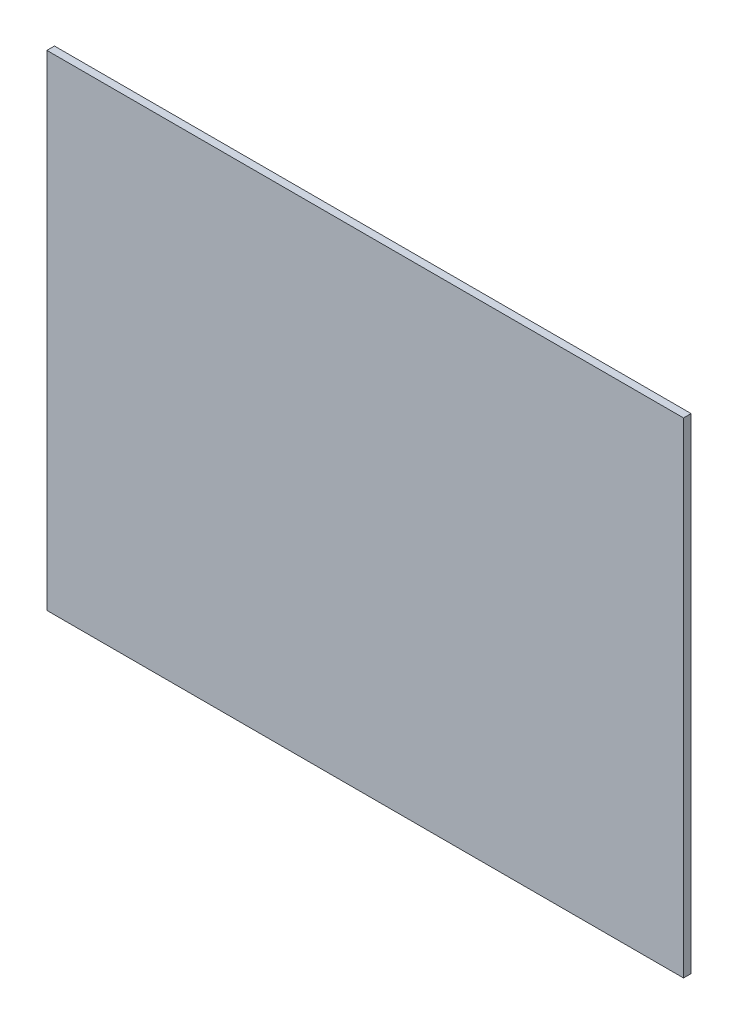
ISO-10303-21;
HEADER;
FILE_DESCRIPTION(('STEP AP214'),'2;1');
FILE_NAME('part.step','',(''),(''),'','','');
FILE_SCHEMA(('AUTOMOTIVE_DESIGN { 1 0 10303 214 1 1 1 1 }'));
ENDSEC;
DATA;
#1=APPLICATION_CONTEXT('core data for automotive mechanical design processes');
#2=APPLICATION_PROTOCOL_DEFINITION('international standard','automotive_design',2000,#1);
#3=PRODUCT_CONTEXT('',#1,'mechanical');
#4=PRODUCT('Part','Part','',(#3));
#5=PRODUCT_RELATED_PRODUCT_CATEGORY('part','',(#4));
#6=PRODUCT_DEFINITION_FORMATION('','',#4);
#7=PRODUCT_DEFINITION_CONTEXT('part definition',#1,'design');
#8=PRODUCT_DEFINITION('design','',#6,#7);
#9=PRODUCT_DEFINITION_SHAPE('','',#8);
#10=(LENGTH_UNIT() NAMED_UNIT(*) SI_UNIT(.MILLI.,.METRE.));
#11=(NAMED_UNIT(*) PLANE_ANGLE_UNIT() SI_UNIT($,.RADIAN.));
#12=(NAMED_UNIT(*) SI_UNIT($,.STERADIAN.) SOLID_ANGLE_UNIT());
#13=UNCERTAINTY_MEASURE_WITH_UNIT(LENGTH_MEASURE(1.E-05),#10,'distance_accuracy_value','');
#14=(GEOMETRIC_REPRESENTATION_CONTEXT(3) GLOBAL_UNCERTAINTY_ASSIGNED_CONTEXT((#13)) GLOBAL_UNIT_ASSIGNED_CONTEXT((#10,
#11,#12)) REPRESENTATION_CONTEXT('',''));
#15=CARTESIAN_POINT('',(0.,0.,0.));
#16=DIRECTION('',(0.,0.,1.));
#17=DIRECTION('',(1.,0.,0.));
#18=AXIS2_PLACEMENT_3D('',#15,#16,#17);
#19=CARTESIAN_POINT('',(210.,-160.,5.));
#20=DIRECTION('',(-1.,0.,0.));
#21=DIRECTION('',(0.,0.,1.));
#22=AXIS2_PLACEMENT_3D('',#19,#20,#21);
#23=PLANE('',#22);
#24=DIRECTION('',(0.,1.,0.));
#25=VECTOR('',#24,1.);
#26=CARTESIAN_POINT('',(210.,-160.,0.));
#27=LINE('',#26,#25);
#28=CARTESIAN_POINT('',(210.,-160.,0.));
#29=VERTEX_POINT('',#28);
#30=CARTESIAN_POINT('',(210.,160.,0.));
#31=VERTEX_POINT('',#30);
#32=EDGE_CURVE('E98',#29,#31,#27,.T.);
#33=ORIENTED_EDGE('',*,*,#32,.T.);
#34=DIRECTION('',(0.,0.,-1.));
#35=VECTOR('',#34,1.);
#36=CARTESIAN_POINT('',(210.,160.,5.));
#37=LINE('',#36,#35);
#38=CARTESIAN_POINT('',(210.,160.,5.));
#39=VERTEX_POINT('',#38);
#40=EDGE_CURVE('E11',#39,#31,#37,.T.);
#41=ORIENTED_EDGE('',*,*,#40,.F.);
#42=DIRECTION('',(0.,1.,0.));
#43=VECTOR('',#42,1.);
#44=CARTESIAN_POINT('',(210.,-160.,5.));
#45=LINE('',#44,#43);
#46=CARTESIAN_POINT('',(210.,-160.,5.));
#47=VERTEX_POINT('',#46);
#48=EDGE_CURVE('E86',#47,#39,#45,.T.);
#49=ORIENTED_EDGE('',*,*,#48,.F.);
#50=DIRECTION('',(0.,0.,-1.));
#51=VECTOR('',#50,1.);
#52=CARTESIAN_POINT('',(210.,-160.,5.));
#53=LINE('',#52,#51);
#54=EDGE_CURVE('E94',#47,#29,#53,.T.);
#55=ORIENTED_EDGE('',*,*,#54,.T.);
#56=EDGE_LOOP('',(#33,#41,#49,#55));
#57=FACE_BOUND('',#56,.T.);
#58=ADVANCED_FACE('F35',(#57),#23,.F.);
#59=CARTESIAN_POINT('',(-210.,160.,5.));
#60=DIRECTION('',(0.,-1.,0.));
#61=DIRECTION('',(0.,0.,-1.));
#62=AXIS2_PLACEMENT_3D('',#59,#60,#61);
#63=PLANE('',#62);
#64=DIRECTION('',(-1.,0.,0.));
#65=VECTOR('',#64,1.);
#66=CARTESIAN_POINT('',(-210.,160.,0.));
#67=LINE('',#66,#65);
#68=CARTESIAN_POINT('',(-210.,160.,0.));
#69=VERTEX_POINT('',#68);
#70=EDGE_CURVE('E90',#31,#69,#67,.T.);
#71=ORIENTED_EDGE('',*,*,#70,.T.);
#72=DIRECTION('',(0.,0.,-1.));
#73=VECTOR('',#72,1.);
#74=CARTESIAN_POINT('',(-210.,160.,5.));
#75=LINE('',#74,#73);
#76=CARTESIAN_POINT('',(-210.,160.,5.));
#77=VERTEX_POINT('',#76);
#78=EDGE_CURVE('E43',#77,#69,#75,.T.);
#79=ORIENTED_EDGE('',*,*,#78,.F.);
#80=DIRECTION('',(-1.,0.,0.));
#81=VECTOR('',#80,1.);
#82=CARTESIAN_POINT('',(-210.,160.,5.));
#83=LINE('',#82,#81);
#84=EDGE_CURVE('E81',#39,#77,#83,.T.);
#85=ORIENTED_EDGE('',*,*,#84,.F.);
#86=ORIENTED_EDGE('',*,*,#40,.T.);
#87=EDGE_LOOP('',(#71,#79,#85,#86));
#88=FACE_BOUND('',#87,.T.);
#89=ADVANCED_FACE('F89',(#88),#63,.F.);
#90=CARTESIAN_POINT('',(-210.,-160.,5.));
#91=DIRECTION('',(1.,0.,0.));
#92=DIRECTION('',(0.,0.,-1.));
#93=AXIS2_PLACEMENT_3D('',#90,#91,#92);
#94=PLANE('',#93);
#95=DIRECTION('',(0.,-1.,0.));
#96=VECTOR('',#95,1.);
#97=CARTESIAN_POINT('',(-210.,-160.,0.));
#98=LINE('',#97,#96);
#99=CARTESIAN_POINT('',(-210.,-160.,0.));
#100=VERTEX_POINT('',#99);
#101=EDGE_CURVE('E68',#69,#100,#98,.T.);
#102=ORIENTED_EDGE('',*,*,#101,.T.);
#103=DIRECTION('',(0.,0.,-1.));
#104=VECTOR('',#103,1.);
#105=CARTESIAN_POINT('',(-210.,-160.,5.));
#106=LINE('',#105,#104);
#107=CARTESIAN_POINT('',(-210.,-160.,5.));
#108=VERTEX_POINT('',#107);
#109=EDGE_CURVE('E91',#108,#100,#106,.T.);
#110=ORIENTED_EDGE('',*,*,#109,.F.);
#111=DIRECTION('',(0.,-1.,0.));
#112=VECTOR('',#111,1.);
#113=CARTESIAN_POINT('',(-210.,-160.,5.));
#114=LINE('',#113,#112);
#115=EDGE_CURVE('E84',#77,#108,#114,.T.);
#116=ORIENTED_EDGE('',*,*,#115,.F.);
#117=ORIENTED_EDGE('',*,*,#78,.T.);
#118=EDGE_LOOP('',(#102,#110,#116,#117));
#119=FACE_BOUND('',#118,.T.);
#120=ADVANCED_FACE('F92',(#119),#94,.F.);
#121=CARTESIAN_POINT('',(-210.,-160.,5.));
#122=DIRECTION('',(0.,1.,0.));
#123=DIRECTION('',(0.,0.,1.));
#124=AXIS2_PLACEMENT_3D('',#121,#122,#123);
#125=PLANE('',#124);
#126=DIRECTION('',(1.,0.,0.));
#127=VECTOR('',#126,1.);
#128=CARTESIAN_POINT('',(-210.,-160.,0.));
#129=LINE('',#128,#127);
#130=EDGE_CURVE('E74',#100,#29,#129,.T.);
#131=ORIENTED_EDGE('',*,*,#130,.T.);
#132=ORIENTED_EDGE('',*,*,#54,.F.);
#133=DIRECTION('',(1.,0.,0.));
#134=VECTOR('',#133,1.);
#135=CARTESIAN_POINT('',(-210.,-160.,5.));
#136=LINE('',#135,#134);
#137=EDGE_CURVE('E51',#108,#47,#136,.T.);
#138=ORIENTED_EDGE('',*,*,#137,.F.);
#139=ORIENTED_EDGE('',*,*,#109,.T.);
#140=EDGE_LOOP('',(#131,#132,#138,#139));
#141=FACE_BOUND('',#140,.T.);
#142=ADVANCED_FACE('F105',(#141),#125,.F.);
#143=CARTESIAN_POINT('',(0.,0.,5.));
#144=DIRECTION('',(0.,0.,-1.));
#145=DIRECTION('',(-1.,0.,0.));
#146=AXIS2_PLACEMENT_3D('',#143,#144,#145);
#147=PLANE('',#146);
#148=ORIENTED_EDGE('',*,*,#48,.T.);
#149=ORIENTED_EDGE('',*,*,#84,.T.);
#150=ORIENTED_EDGE('',*,*,#115,.T.);
#151=ORIENTED_EDGE('',*,*,#137,.T.);
#152=EDGE_LOOP('',(#148,#149,#150,#151));
#153=FACE_BOUND('',#152,.T.);
#154=ADVANCED_FACE('F82',(#153),#147,.F.);
#155=CARTESIAN_POINT('',(0.,0.,0.));
#156=DIRECTION('',(0.,0.,-1.));
#157=DIRECTION('',(-1.,0.,0.));
#158=AXIS2_PLACEMENT_3D('',#155,#156,#157);
#159=PLANE('',#158);
#160=ORIENTED_EDGE('',*,*,#32,.F.);
#161=ORIENTED_EDGE('',*,*,#130,.F.);
#162=ORIENTED_EDGE('',*,*,#101,.F.);
#163=ORIENTED_EDGE('',*,*,#70,.F.);
#164=EDGE_LOOP('',(#160,#161,#162,#163));
#165=FACE_BOUND('',#164,.T.);
#166=ADVANCED_FACE('F108',(#165),#159,.T.);
#167=CLOSED_SHELL('',(#58,#89,#120,#142,#154,#166));
#168=MANIFOLD_SOLID_BREP('B2',#167);
#169=ADVANCED_BREP_SHAPE_REPRESENTATION('',(#18,#168),#14);
#170=SHAPE_DEFINITION_REPRESENTATION(#9,#169);
ENDSEC;
END-ISO-10303-21;
